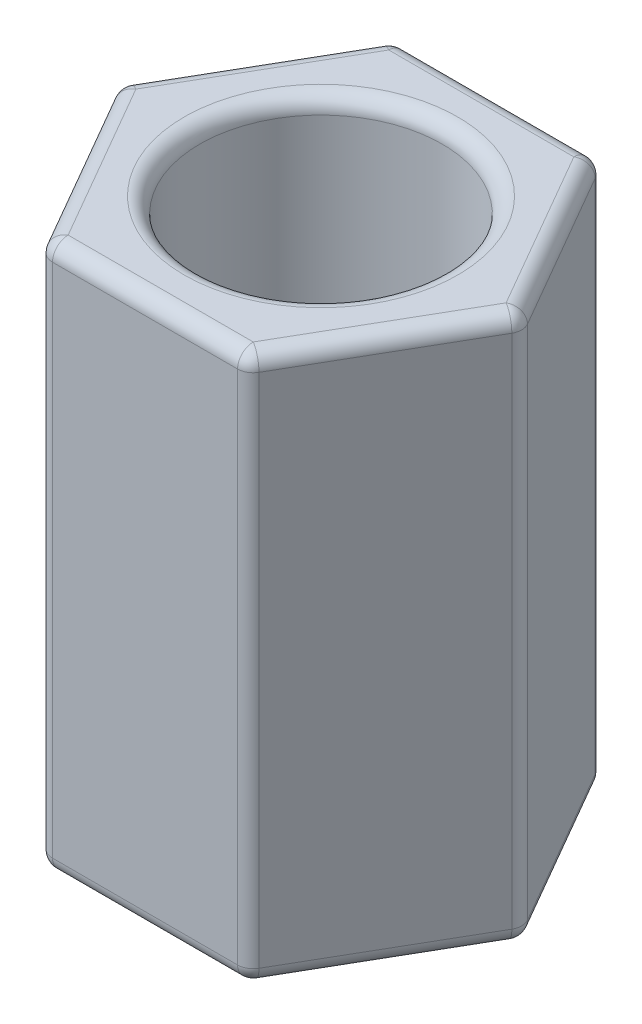
ISO-10303-21;
HEADER;
FILE_DESCRIPTION(('STEP AP214'),'2;1');
FILE_NAME('part.step','',(''),(''),'','','');
FILE_SCHEMA(('AUTOMOTIVE_DESIGN { 1 0 10303 214 1 1 1 1 }'));
ENDSEC;
DATA;
#1=APPLICATION_CONTEXT('core data for automotive mechanical design processes');
#2=APPLICATION_PROTOCOL_DEFINITION('international standard','automotive_design',2000,#1);
#3=PRODUCT_CONTEXT('',#1,'mechanical');
#4=PRODUCT('Part','Part','',(#3));
#5=PRODUCT_RELATED_PRODUCT_CATEGORY('part','',(#4));
#6=PRODUCT_DEFINITION_FORMATION('','',#4);
#7=PRODUCT_DEFINITION_CONTEXT('part definition',#1,'design');
#8=PRODUCT_DEFINITION('design','',#6,#7);
#9=PRODUCT_DEFINITION_SHAPE('','',#8);
#10=(LENGTH_UNIT() NAMED_UNIT(*) SI_UNIT(.MILLI.,.METRE.));
#11=(NAMED_UNIT(*) PLANE_ANGLE_UNIT() SI_UNIT($,.RADIAN.));
#12=(NAMED_UNIT(*) SI_UNIT($,.STERADIAN.) SOLID_ANGLE_UNIT());
#13=UNCERTAINTY_MEASURE_WITH_UNIT(LENGTH_MEASURE(1.E-05),#10,'distance_accuracy_value','');
#14=(GEOMETRIC_REPRESENTATION_CONTEXT(3) GLOBAL_UNCERTAINTY_ASSIGNED_CONTEXT((#13)) GLOBAL_UNIT_ASSIGNED_CONTEXT((#10,
#11,#12)) REPRESENTATION_CONTEXT('',''));
#15=CARTESIAN_POINT('',(0.,0.,0.));
#16=DIRECTION('',(0.,0.,1.));
#17=DIRECTION('',(1.,0.,0.));
#18=AXIS2_PLACEMENT_3D('',#15,#16,#17);
#19=CARTESIAN_POINT('',(0.,7.,-4.5));
#20=DIRECTION('',(0.,0.,1.));
#21=DIRECTION('',(1.,0.,0.));
#22=AXIS2_PLACEMENT_3D('',#19,#20,#21);
#23=PLANE('',#22);
#24=DIRECTION('',(-1.,0.,0.));
#25=VECTOR('',#24,1.);
#26=CARTESIAN_POINT('',(3.89711431702997,6.8,-4.5));
#27=LINE('',#26,#25);
#28=CARTESIAN_POINT('',(1.41450815951458,6.8,-4.5));
#29=VERTEX_POINT('',#28);
#30=CARTESIAN_POINT('',(3.78164426319204,6.8,-4.5));
#31=VERTEX_POINT('',#30);
#32=EDGE_CURVE('E206',#29,#31,#27,.F.);
#33=ORIENTED_EDGE('',*,*,#32,.T.);
#34=DIRECTION('',(0.,-1.,0.));
#35=VECTOR('',#34,1.);
#36=CARTESIAN_POINT('',(3.78164426319204,7.,-4.5));
#37=LINE('',#36,#35);
#38=CARTESIAN_POINT('',(3.78164426319204,0.2,-4.5));
#39=VERTEX_POINT('',#38);
#40=EDGE_CURVE('E176',#31,#39,#37,.T.);
#41=ORIENTED_EDGE('',*,*,#40,.T.);
#42=DIRECTION('',(-1.,0.,0.));
#43=VECTOR('',#42,1.);
#44=CARTESIAN_POINT('',(0.,0.2,-4.5));
#45=LINE('',#44,#43);
#46=CARTESIAN_POINT('',(1.41450815951458,0.2,-4.5));
#47=VERTEX_POINT('',#46);
#48=EDGE_CURVE('E196',#39,#47,#45,.T.);
#49=ORIENTED_EDGE('',*,*,#48,.T.);
#50=DIRECTION('',(0.,-1.,0.));
#51=VECTOR('',#50,1.);
#52=CARTESIAN_POINT('',(1.41450815951458,7.,-4.5));
#53=LINE('',#52,#51);
#54=EDGE_CURVE('E203',#47,#29,#53,.F.);
#55=ORIENTED_EDGE('',*,*,#54,.T.);
#56=EDGE_LOOP('',(#33,#41,#49,#55));
#57=FACE_BOUND('',#56,.T.);
#58=ADVANCED_FACE('F43',(#57),#23,.F.);
#59=CARTESIAN_POINT('',(-0.974278579257493,7.,-0.562499999999997));
#60=DIRECTION('',(0.86602540378444,0.,0.499999999999998));
#61=DIRECTION('',(0.499999999999998,0.,-0.86602540378444));
#62=AXIS2_PLACEMENT_3D('',#59,#60,#61);
#63=PLANE('',#62);
#64=DIRECTION('',(-0.499999999999998,0.,0.86602540378444));
#65=VECTOR('',#64,1.);
#66=CARTESIAN_POINT('',(1.29903810567665,6.8,-4.5));
#67=LINE('',#66,#65);
#68=CARTESIAN_POINT('',(0.0577350269189615,6.8,-2.35));
#69=VERTEX_POINT('',#68);
#70=CARTESIAN_POINT('',(1.24130307875769,6.8,-4.4));
#71=VERTEX_POINT('',#70);
#72=EDGE_CURVE('E248',#69,#71,#67,.F.);
#73=ORIENTED_EDGE('',*,*,#72,.T.);
#74=DIRECTION('',(0.,-1.,0.));
#75=VECTOR('',#74,1.);
#76=CARTESIAN_POINT('',(1.24130307875769,7.,-4.4));
#77=LINE('',#76,#75);
#78=CARTESIAN_POINT('',(1.24130307875769,0.2,-4.4));
#79=VERTEX_POINT('',#78);
#80=EDGE_CURVE('E257',#71,#79,#77,.T.);
#81=ORIENTED_EDGE('',*,*,#80,.T.);
#82=DIRECTION('',(-0.499999999999998,0.,0.86602540378444));
#83=VECTOR('',#82,1.);
#84=CARTESIAN_POINT('',(-0.974278579257493,0.2,-0.562499999999997));
#85=LINE('',#84,#83);
#86=CARTESIAN_POINT('',(0.0577350269189615,0.2,-2.35));
#87=VERTEX_POINT('',#86);
#88=EDGE_CURVE('E254',#79,#87,#85,.T.);
#89=ORIENTED_EDGE('',*,*,#88,.T.);
#90=DIRECTION('',(0.,-1.,0.));
#91=VECTOR('',#90,1.);
#92=CARTESIAN_POINT('',(0.0577350269189616,7.,-2.35));
#93=LINE('',#92,#91);
#94=EDGE_CURVE('E251',#87,#69,#93,.F.);
#95=ORIENTED_EDGE('',*,*,#94,.T.);
#96=EDGE_LOOP('',(#73,#81,#89,#95));
#97=FACE_BOUND('',#96,.T.);
#98=ADVANCED_FACE('F505',(#97),#63,.F.);
#99=CARTESIAN_POINT('',(0.974278579257492,7.,-0.562499999999996));
#100=DIRECTION('',(0.86602540378444,0.,-0.499999999999998));
#101=DIRECTION('',(-0.499999999999998,0.,-0.86602540378444));
#102=AXIS2_PLACEMENT_3D('',#99,#100,#101);
#103=PLANE('',#102);
#104=DIRECTION('',(0.,-1.,0.));
#105=VECTOR('',#104,1.);
#106=CARTESIAN_POINT('',(0.0577350269189615,7.,-2.15));
#107=LINE('',#106,#105);
#108=CARTESIAN_POINT('',(0.0577350269189614,6.8,-2.15));
#109=VERTEX_POINT('',#108);
#110=CARTESIAN_POINT('',(0.0577350269189615,0.2,-2.15));
#111=VERTEX_POINT('',#110);
#112=EDGE_CURVE('E53',#109,#111,#107,.T.);
#113=ORIENTED_EDGE('',*,*,#112,.T.);
#114=DIRECTION('',(0.499999999999998,0.,0.86602540378444));
#115=VECTOR('',#114,1.);
#116=CARTESIAN_POINT('',(0.974278579257492,0.2,-0.562499999999996));
#117=LINE('',#116,#115);
#118=CARTESIAN_POINT('',(1.24130307875769,0.2,-0.1));
#119=VERTEX_POINT('',#118);
#120=EDGE_CURVE('E11',#111,#119,#117,.T.);
#121=ORIENTED_EDGE('',*,*,#120,.T.);
#122=DIRECTION('',(0.,-1.,0.));
#123=VECTOR('',#122,1.);
#124=CARTESIAN_POINT('',(1.24130307875769,7.,-0.1));
#125=LINE('',#124,#123);
#126=CARTESIAN_POINT('',(1.24130307875769,6.8,-0.1));
#127=VERTEX_POINT('',#126);
#128=EDGE_CURVE('E321',#119,#127,#125,.F.);
#129=ORIENTED_EDGE('',*,*,#128,.T.);
#130=DIRECTION('',(0.499999999999998,0.,0.86602540378444));
#131=VECTOR('',#130,1.);
#132=CARTESIAN_POINT('',(0.,6.8,-2.25));
#133=LINE('',#132,#131);
#134=EDGE_CURVE('E318',#127,#109,#133,.F.);
#135=ORIENTED_EDGE('',*,*,#134,.T.);
#136=EDGE_LOOP('',(#113,#121,#129,#135));
#137=FACE_BOUND('',#136,.T.);
#138=ADVANCED_FACE('F472',(#137),#103,.F.);
#139=CARTESIAN_POINT('',(0.,7.,0.));
#140=DIRECTION('',(0.,0.,-1.));
#141=DIRECTION('',(-1.,0.,0.));
#142=AXIS2_PLACEMENT_3D('',#139,#140,#141);
#143=PLANE('',#142);
#144=DIRECTION('',(0.,-1.,0.));
#145=VECTOR('',#144,1.);
#146=CARTESIAN_POINT('',(1.41450815951458,7.,0.));
#147=LINE('',#146,#145);
#148=CARTESIAN_POINT('',(1.41450815951458,6.8,0.));
#149=VERTEX_POINT('',#148);
#150=CARTESIAN_POINT('',(1.41450815951458,0.2,0.));
#151=VERTEX_POINT('',#150);
#152=EDGE_CURVE('E308',#149,#151,#147,.T.);
#153=ORIENTED_EDGE('',*,*,#152,.T.);
#154=DIRECTION('',(1.,0.,0.));
#155=VECTOR('',#154,1.);
#156=CARTESIAN_POINT('',(0.,0.2,0.));
#157=LINE('',#156,#155);
#158=CARTESIAN_POINT('',(3.78164426319204,0.2,0.));
#159=VERTEX_POINT('',#158);
#160=EDGE_CURVE('E314',#151,#159,#157,.T.);
#161=ORIENTED_EDGE('',*,*,#160,.T.);
#162=DIRECTION('',(0.,-1.,0.));
#163=VECTOR('',#162,1.);
#164=CARTESIAN_POINT('',(3.78164426319204,7.,0.));
#165=LINE('',#164,#163);
#166=CARTESIAN_POINT('',(3.78164426319204,6.8,0.));
#167=VERTEX_POINT('',#166);
#168=EDGE_CURVE('E311',#159,#167,#165,.F.);
#169=ORIENTED_EDGE('',*,*,#168,.T.);
#170=DIRECTION('',(1.,0.,0.));
#171=VECTOR('',#170,1.);
#172=CARTESIAN_POINT('',(1.29903810567665,6.8,0.));
#173=LINE('',#172,#171);
#174=EDGE_CURVE('E305',#167,#149,#173,.F.);
#175=ORIENTED_EDGE('',*,*,#174,.T.);
#176=EDGE_LOOP('',(#153,#161,#169,#175));
#177=FACE_BOUND('',#176,.T.);
#178=ADVANCED_FACE('F910',(#177),#143,.F.);
#179=CARTESIAN_POINT('',(2.92283573777248,7.,1.68749999999999));
#180=DIRECTION('',(-0.866025403784439,0.,-0.499999999999999));
#181=DIRECTION('',(-0.499999999999999,0.,0.866025403784439));
#182=AXIS2_PLACEMENT_3D('',#179,#180,#181);
#183=PLANE('',#182);
#184=DIRECTION('',(0.,-1.,0.));
#185=VECTOR('',#184,1.);
#186=CARTESIAN_POINT('',(3.95484934394893,7.,-0.100000000000001));
#187=LINE('',#186,#185);
#188=CARTESIAN_POINT('',(3.95484934394893,6.8,-0.100000000000001));
#189=VERTEX_POINT('',#188);
#190=CARTESIAN_POINT('',(3.95484934394893,0.2,-0.100000000000001));
#191=VERTEX_POINT('',#190);
#192=EDGE_CURVE('E295',#189,#191,#187,.T.);
#193=ORIENTED_EDGE('',*,*,#192,.T.);
#194=DIRECTION('',(0.499999999999999,0.,-0.866025403784439));
#195=VECTOR('',#194,1.);
#196=CARTESIAN_POINT('',(2.92283573777248,0.2,1.68749999999999));
#197=LINE('',#196,#195);
#198=CARTESIAN_POINT('',(5.13841739578766,0.2,-2.15));
#199=VERTEX_POINT('',#198);
#200=EDGE_CURVE('E301',#191,#199,#197,.T.);
#201=ORIENTED_EDGE('',*,*,#200,.T.);
#202=DIRECTION('',(0.,-1.,0.));
#203=VECTOR('',#202,1.);
#204=CARTESIAN_POINT('',(5.13841739578766,7.,-2.15));
#205=LINE('',#204,#203);
#206=CARTESIAN_POINT('',(5.13841739578766,6.8,-2.15));
#207=VERTEX_POINT('',#206);
#208=EDGE_CURVE('E298',#199,#207,#205,.F.);
#209=ORIENTED_EDGE('',*,*,#208,.T.);
#210=DIRECTION('',(0.499999999999999,0.,-0.866025403784439));
#211=VECTOR('',#210,1.);
#212=CARTESIAN_POINT('',(3.89711431702997,6.8,0.));
#213=LINE('',#212,#211);
#214=EDGE_CURVE('E292',#207,#189,#213,.F.);
#215=ORIENTED_EDGE('',*,*,#214,.T.);
#216=EDGE_LOOP('',(#193,#201,#209,#215));
#217=FACE_BOUND('',#216,.T.);
#218=ADVANCED_FACE('F518',(#217),#183,.F.);
#219=CARTESIAN_POINT('',(2.59807621135331,7.,-2.25));
#220=DIRECTION('',(0.,-1.,0.));
#221=DIRECTION('',(0.,0.,-1.));
#222=AXIS2_PLACEMENT_3D('',#219,#220,#221);
#223=CYLINDRICAL_SURFACE('',#222,1.55);
#224=CARTESIAN_POINT('',(2.59807621135331,6.8,-2.25));
#225=DIRECTION('',(0.,1.,0.));
#226=DIRECTION('',(0.,0.,1.));
#227=AXIS2_PLACEMENT_3D('',#224,#225,#226);
#228=CIRCLE('',#227,1.55);
#229=CARTESIAN_POINT('',(2.59807621135331,6.8,-0.700000000000002));
#230=VERTEX_POINT('',#229);
#231=EDGE_CURVE('E288',#230,#230,#228,.T.);
#232=ORIENTED_EDGE('',*,*,#231,.T.);
#233=EDGE_LOOP('',(#232));
#234=FACE_BOUND('',#233,.T.);
#235=CARTESIAN_POINT('',(2.59807621135331,0.2,-2.25));
#236=DIRECTION('',(0.,1.,0.));
#237=DIRECTION('',(0.,0.,1.));
#238=AXIS2_PLACEMENT_3D('',#235,#236,#237);
#239=CIRCLE('',#238,1.55);
#240=CARTESIAN_POINT('',(2.59807621135331,0.2,-0.700000000000002));
#241=VERTEX_POINT('',#240);
#242=EDGE_CURVE('E284',#241,#241,#239,.F.);
#243=ORIENTED_EDGE('',*,*,#242,.T.);
#244=EDGE_LOOP('',(#243));
#245=FACE_BOUND('',#244,.T.);
#246=ADVANCED_FACE('F514',(#234,#245),#223,.F.);
#247=CARTESIAN_POINT('',(4.87139289628747,7.,-2.81249999999999));
#248=DIRECTION('',(-0.866025403784439,0.,0.499999999999999));
#249=DIRECTION('',(0.499999999999999,0.,0.866025403784439));
#250=AXIS2_PLACEMENT_3D('',#247,#248,#249);
#251=PLANE('',#250);
#252=DIRECTION('',(-0.499999999999999,0.,-0.866025403784439));
#253=VECTOR('',#252,1.);
#254=CARTESIAN_POINT('',(4.87139289628747,0.2,-2.81249999999999));
#255=LINE('',#254,#253);
#256=CARTESIAN_POINT('',(5.13841739578766,0.2,-2.35));
#257=VERTEX_POINT('',#256);
#258=CARTESIAN_POINT('',(3.95484934394893,0.2,-4.4));
#259=VERTEX_POINT('',#258);
#260=EDGE_CURVE('E220',#257,#259,#255,.T.);
#261=ORIENTED_EDGE('',*,*,#260,.T.);
#262=DIRECTION('',(0.,-1.,0.));
#263=VECTOR('',#262,1.);
#264=CARTESIAN_POINT('',(3.95484934394893,7.,-4.4));
#265=LINE('',#264,#263);
#266=CARTESIAN_POINT('',(3.95484934394893,6.8,-4.4));
#267=VERTEX_POINT('',#266);
#268=EDGE_CURVE('E178',#259,#267,#265,.F.);
#269=ORIENTED_EDGE('',*,*,#268,.T.);
#270=DIRECTION('',(-0.499999999999999,0.,-0.866025403784439));
#271=VECTOR('',#270,1.);
#272=CARTESIAN_POINT('',(5.19615242270662,6.8,-2.25));
#273=LINE('',#272,#271);
#274=CARTESIAN_POINT('',(5.13841739578766,6.8,-2.35));
#275=VERTEX_POINT('',#274);
#276=EDGE_CURVE('E209',#267,#275,#273,.F.);
#277=ORIENTED_EDGE('',*,*,#276,.T.);
#278=DIRECTION('',(0.,-1.,0.));
#279=VECTOR('',#278,1.);
#280=CARTESIAN_POINT('',(5.13841739578766,7.,-2.35));
#281=LINE('',#280,#279);
#282=EDGE_CURVE('E213',#275,#257,#281,.T.);
#283=ORIENTED_EDGE('',*,*,#282,.T.);
#284=EDGE_LOOP('',(#261,#269,#277,#283));
#285=FACE_BOUND('',#284,.T.);
#286=ADVANCED_FACE('F517',(#285),#251,.F.);
#287=CARTESIAN_POINT('',(0.,7.,0.));
#288=DIRECTION('',(0.,1.,0.));
#289=DIRECTION('',(0.,0.,1.));
#290=AXIS2_PLACEMENT_3D('',#287,#288,#289);
#291=PLANE('',#290);
#292=CARTESIAN_POINT('',(2.59807621135331,7.,-2.25));
#293=DIRECTION('',(0.,1.,0.));
#294=DIRECTION('',(0.,0.,1.));
#295=AXIS2_PLACEMENT_3D('',#292,#293,#294);
#296=CIRCLE('',#295,1.75);
#297=CARTESIAN_POINT('',(2.59807621135331,7.,-0.500000000000002));
#298=VERTEX_POINT('',#297);
#299=EDGE_CURVE('E244',#298,#298,#296,.F.);
#300=ORIENTED_EDGE('',*,*,#299,.T.);
#301=EDGE_LOOP('',(#300));
#302=FACE_BOUND('',#301,.T.);
#303=DIRECTION('',(-1.,0.,0.));
#304=VECTOR('',#303,1.);
#305=CARTESIAN_POINT('',(1.29903810567665,7.,-4.3));
#306=LINE('',#305,#304);
#307=CARTESIAN_POINT('',(3.78164426319204,7.,-4.3));
#308=VERTEX_POINT('',#307);
#309=CARTESIAN_POINT('',(1.41450815951458,7.,-4.3));
#310=VERTEX_POINT('',#309);
#311=EDGE_CURVE('E237',#308,#310,#306,.T.);
#312=ORIENTED_EDGE('',*,*,#311,.T.);
#313=DIRECTION('',(-0.499999999999998,0.,0.86602540378444));
#314=VECTOR('',#313,1.);
#315=CARTESIAN_POINT('',(0.173205080756887,7.,-2.15));
#316=LINE('',#315,#314);
#317=CARTESIAN_POINT('',(0.230940107675849,7.,-2.25));
#318=VERTEX_POINT('',#317);
#319=EDGE_CURVE('E241',#310,#318,#316,.T.);
#320=ORIENTED_EDGE('',*,*,#319,.T.);
#321=DIRECTION('',(0.499999999999998,0.,0.86602540378444));
#322=VECTOR('',#321,1.);
#323=CARTESIAN_POINT('',(1.47224318643354,7.,-0.0999999999999995));
#324=LINE('',#323,#322);
#325=CARTESIAN_POINT('',(1.41450815951458,7.,-0.2));
#326=VERTEX_POINT('',#325);
#327=EDGE_CURVE('E234',#318,#326,#324,.T.);
#328=ORIENTED_EDGE('',*,*,#327,.T.);
#329=DIRECTION('',(1.,0.,0.));
#330=VECTOR('',#329,1.);
#331=CARTESIAN_POINT('',(3.89711431702997,7.,-0.2));
#332=LINE('',#331,#330);
#333=CARTESIAN_POINT('',(3.78164426319204,7.,-0.2));
#334=VERTEX_POINT('',#333);
#335=EDGE_CURVE('E225',#326,#334,#332,.T.);
#336=ORIENTED_EDGE('',*,*,#335,.T.);
#337=DIRECTION('',(0.499999999999999,0.,-0.866025403784439));
#338=VECTOR('',#337,1.);
#339=CARTESIAN_POINT('',(5.02294734194973,7.,-2.35));
#340=LINE('',#339,#338);
#341=CARTESIAN_POINT('',(4.96521231503077,7.,-2.25));
#342=VERTEX_POINT('',#341);
#343=EDGE_CURVE('E228',#334,#342,#340,.T.);
#344=ORIENTED_EDGE('',*,*,#343,.T.);
#345=DIRECTION('',(-0.499999999999999,0.,-0.866025403784439));
#346=VECTOR('',#345,1.);
#347=CARTESIAN_POINT('',(3.72390923627308,7.,-4.4));
#348=LINE('',#347,#346);
#349=EDGE_CURVE('E231',#342,#308,#348,.T.);
#350=ORIENTED_EDGE('',*,*,#349,.T.);
#351=EDGE_LOOP('',(#312,#320,#328,#336,#344,#350));
#352=FACE_BOUND('',#351,.T.);
#353=ADVANCED_FACE('F464',(#302,#352),#291,.T.);
#354=CARTESIAN_POINT('',(0.,0.,0.));
#355=DIRECTION('',(0.,1.,0.));
#356=DIRECTION('',(0.,0.,1.));
#357=AXIS2_PLACEMENT_3D('',#354,#355,#356);
#358=PLANE('',#357);
#359=CARTESIAN_POINT('',(2.59807621135331,0.,-2.25));
#360=DIRECTION('',(0.,1.,0.));
#361=DIRECTION('',(0.,0.,1.));
#362=AXIS2_PLACEMENT_3D('',#359,#360,#361);
#363=CIRCLE('',#362,1.75);
#364=CARTESIAN_POINT('',(2.59807621135331,0.,-0.500000000000002));
#365=VERTEX_POINT('',#364);
#366=EDGE_CURVE('E280',#365,#365,#363,.T.);
#367=ORIENTED_EDGE('',*,*,#366,.T.);
#368=EDGE_LOOP('',(#367));
#369=FACE_BOUND('',#368,.T.);
#370=DIRECTION('',(-0.499999999999998,0.,0.86602540378444));
#371=VECTOR('',#370,1.);
#372=CARTESIAN_POINT('',(-0.801073498500604,0.,-0.462499999999997));
#373=LINE('',#372,#371);
#374=CARTESIAN_POINT('',(0.23094010767585,0.,-2.25));
#375=VERTEX_POINT('',#374);
#376=CARTESIAN_POINT('',(1.41450815951458,0.,-4.3));
#377=VERTEX_POINT('',#376);
#378=EDGE_CURVE('E261',#375,#377,#373,.F.);
#379=ORIENTED_EDGE('',*,*,#378,.T.);
#380=DIRECTION('',(-1.,0.,0.));
#381=VECTOR('',#380,1.);
#382=CARTESIAN_POINT('',(0.,0.,-4.3));
#383=LINE('',#382,#381);
#384=CARTESIAN_POINT('',(3.78164426319204,0.,-4.3));
#385=VERTEX_POINT('',#384);
#386=EDGE_CURVE('E276',#377,#385,#383,.F.);
#387=ORIENTED_EDGE('',*,*,#386,.T.);
#388=DIRECTION('',(-0.499999999999999,0.,-0.866025403784439));
#389=VECTOR('',#388,1.);
#390=CARTESIAN_POINT('',(4.69818781553058,0.,-2.71249999999999));
#391=LINE('',#390,#389);
#392=CARTESIAN_POINT('',(4.96521231503077,0.,-2.25));
#393=VERTEX_POINT('',#392);
#394=EDGE_CURVE('E273',#385,#393,#391,.F.);
#395=ORIENTED_EDGE('',*,*,#394,.T.);
#396=DIRECTION('',(0.499999999999999,0.,-0.866025403784439));
#397=VECTOR('',#396,1.);
#398=CARTESIAN_POINT('',(2.74963065701559,0.,1.58749999999999));
#399=LINE('',#398,#397);
#400=CARTESIAN_POINT('',(3.78164426319204,0.,-0.2));
#401=VERTEX_POINT('',#400);
#402=EDGE_CURVE('E270',#393,#401,#399,.F.);
#403=ORIENTED_EDGE('',*,*,#402,.T.);
#404=DIRECTION('',(1.,0.,0.));
#405=VECTOR('',#404,1.);
#406=CARTESIAN_POINT('',(0.,0.,-0.2));
#407=LINE('',#406,#405);
#408=CARTESIAN_POINT('',(1.41450815951458,0.,-0.2));
#409=VERTEX_POINT('',#408);
#410=EDGE_CURVE('E267',#401,#409,#407,.F.);
#411=ORIENTED_EDGE('',*,*,#410,.T.);
#412=DIRECTION('',(0.499999999999998,0.,0.86602540378444));
#413=VECTOR('',#412,1.);
#414=CARTESIAN_POINT('',(1.14748366001438,0.,-0.662499999999996));
#415=LINE('',#414,#413);
#416=EDGE_CURVE('E264',#409,#375,#415,.F.);
#417=ORIENTED_EDGE('',*,*,#416,.T.);
#418=EDGE_LOOP('',(#379,#387,#395,#403,#411,#417));
#419=FACE_BOUND('',#418,.T.);
#420=ADVANCED_FACE('F486',(#369,#419),#358,.F.);
#421=CARTESIAN_POINT('',(1.41450815951458,7.,-0.2));
#422=DIRECTION('',(0.,-1.,0.));
#423=DIRECTION('',(0.,0.,-1.));
#424=AXIS2_PLACEMENT_3D('',#421,#422,#423);
#425=CYLINDRICAL_SURFACE('',#424,0.2);
#426=CARTESIAN_POINT('',(1.41450815951458,6.8,-0.2));
#427=DIRECTION('',(0.,1.,0.));
#428=DIRECTION('',(0.,0.,1.));
#429=AXIS2_PLACEMENT_3D('',#426,#427,#428);
#430=CIRCLE('',#429,0.2);
#431=EDGE_CURVE('E47',#127,#149,#430,.T.);
#432=ORIENTED_EDGE('',*,*,#431,.F.);
#433=ORIENTED_EDGE('',*,*,#128,.F.);
#434=CARTESIAN_POINT('',(1.41450815951458,0.2,-0.2));
#435=DIRECTION('',(0.,-1.,0.));
#436=DIRECTION('',(0.,0.,-1.));
#437=AXIS2_PLACEMENT_3D('',#434,#435,#436);
#438=CIRCLE('',#437,0.2);
#439=EDGE_CURVE('E440',#151,#119,#438,.T.);
#440=ORIENTED_EDGE('',*,*,#439,.F.);
#441=ORIENTED_EDGE('',*,*,#152,.F.);
#442=EDGE_LOOP('',(#432,#433,#440,#441));
#443=FACE_BOUND('',#442,.T.);
#444=ADVANCED_FACE('F502',(#443),#425,.T.);
#445=CARTESIAN_POINT('',(1.41450815951458,6.8,-0.2));
#446=DIRECTION('',(0.,1.,0.));
#447=DIRECTION('',(0.,0.,1.));
#448=AXIS2_PLACEMENT_3D('',#445,#446,#447);
#449=SPHERICAL_SURFACE('',#448,0.2);
#450=CARTESIAN_POINT('',(1.41450815951458,6.8,-0.2));
#451=DIRECTION('',(0.499999999999998,0.,0.86602540378444));
#452=DIRECTION('',(0.86602540378444,0.,-0.499999999999998));
#453=AXIS2_PLACEMENT_3D('',#450,#451,#452);
#454=CIRCLE('',#453,0.2);
#455=EDGE_CURVE('E433',#127,#326,#454,.F.);
#456=ORIENTED_EDGE('',*,*,#455,.F.);
#457=ORIENTED_EDGE('',*,*,#431,.T.);
#458=CARTESIAN_POINT('',(1.41450815951458,6.8,-0.2));
#459=DIRECTION('',(-1.,0.,0.));
#460=DIRECTION('',(0.,0.,1.));
#461=AXIS2_PLACEMENT_3D('',#458,#459,#460);
#462=CIRCLE('',#461,0.2);
#463=EDGE_CURVE('E437',#326,#149,#462,.F.);
#464=ORIENTED_EDGE('',*,*,#463,.F.);
#465=EDGE_LOOP('',(#456,#457,#464));
#466=FACE_BOUND('',#465,.T.);
#467=ADVANCED_FACE('F452',(#466),#449,.T.);
#468=CARTESIAN_POINT('',(1.41450815951458,0.2,-0.2));
#469=DIRECTION('',(0.,-1.,0.));
#470=DIRECTION('',(0.,0.,-1.));
#471=AXIS2_PLACEMENT_3D('',#468,#469,#470);
#472=SPHERICAL_SURFACE('',#471,0.2);
#473=CARTESIAN_POINT('',(1.41450815951458,0.2,-0.2));
#474=DIRECTION('',(-1.,0.,0.));
#475=DIRECTION('',(0.,0.,1.));
#476=AXIS2_PLACEMENT_3D('',#473,#474,#475);
#477=CIRCLE('',#476,0.2);
#478=EDGE_CURVE('E427',#151,#409,#477,.F.);
#479=ORIENTED_EDGE('',*,*,#478,.F.);
#480=ORIENTED_EDGE('',*,*,#439,.T.);
#481=CARTESIAN_POINT('',(1.41450815951458,0.2,-0.2));
#482=DIRECTION('',(0.499999999999998,0.,0.86602540378444));
#483=DIRECTION('',(0.86602540378444,0.,-0.499999999999998));
#484=AXIS2_PLACEMENT_3D('',#481,#482,#483);
#485=CIRCLE('',#484,0.2);
#486=EDGE_CURVE('E66',#409,#119,#485,.F.);
#487=ORIENTED_EDGE('',*,*,#486,.F.);
#488=EDGE_LOOP('',(#479,#480,#487));
#489=FACE_BOUND('',#488,.T.);
#490=ADVANCED_FACE('F494',(#489),#472,.T.);
#491=CARTESIAN_POINT('',(0.,6.8,-0.2));
#492=DIRECTION('',(-1.,0.,0.));
#493=DIRECTION('',(0.,0.,1.));
#494=AXIS2_PLACEMENT_3D('',#491,#492,#493);
#495=CYLINDRICAL_SURFACE('',#494,0.2);
#496=ORIENTED_EDGE('',*,*,#463,.T.);
#497=ORIENTED_EDGE('',*,*,#174,.F.);
#498=CARTESIAN_POINT('',(3.78164426319204,6.8,-0.2));
#499=DIRECTION('',(1.,0.,0.));
#500=DIRECTION('',(0.,0.,-1.));
#501=AXIS2_PLACEMENT_3D('',#498,#499,#500);
#502=CIRCLE('',#501,0.2);
#503=EDGE_CURVE('E419',#334,#167,#502,.T.);
#504=ORIENTED_EDGE('',*,*,#503,.F.);
#505=ORIENTED_EDGE('',*,*,#335,.F.);
#506=EDGE_LOOP('',(#496,#497,#504,#505));
#507=FACE_BOUND('',#506,.T.);
#508=ADVANCED_FACE('F459',(#507),#495,.T.);
#509=CARTESIAN_POINT('',(1.14748366001438,6.8,-0.662499999999996));
#510=DIRECTION('',(-0.499999999999998,0.,-0.86602540378444));
#511=DIRECTION('',(-0.86602540378444,0.,0.499999999999998));
#512=AXIS2_PLACEMENT_3D('',#509,#510,#511);
#513=CYLINDRICAL_SURFACE('',#512,0.2);
#514=ORIENTED_EDGE('',*,*,#455,.T.);
#515=ORIENTED_EDGE('',*,*,#327,.F.);
#516=CARTESIAN_POINT('',(0.230940107675849,6.8,-2.25));
#517=DIRECTION('',(-0.499999999999999,0.,-0.866025403784439));
#518=DIRECTION('',(-0.866025403784439,0.,0.499999999999999));
#519=AXIS2_PLACEMENT_3D('',#516,#517,#518);
#520=CIRCLE('',#519,0.2);
#521=EDGE_CURVE('E415',#109,#318,#520,.T.);
#522=ORIENTED_EDGE('',*,*,#521,.F.);
#523=ORIENTED_EDGE('',*,*,#134,.F.);
#524=EDGE_LOOP('',(#514,#515,#522,#523));
#525=FACE_BOUND('',#524,.T.);
#526=ADVANCED_FACE('F471',(#525),#513,.T.);
#527=CARTESIAN_POINT('',(0.230940107675849,7.,-2.25));
#528=DIRECTION('',(0.,-1.,0.));
#529=DIRECTION('',(0.,0.,-1.));
#530=AXIS2_PLACEMENT_3D('',#527,#528,#529);
#531=CYLINDRICAL_SURFACE('',#530,0.2);
#532=CARTESIAN_POINT('',(0.230940107675849,0.2,-2.25));
#533=DIRECTION('',(0.,-1.,0.));
#534=DIRECTION('',(0.,0.,-1.));
#535=AXIS2_PLACEMENT_3D('',#532,#533,#534);
#536=CIRCLE('',#535,0.2);
#537=EDGE_CURVE('E407',#111,#87,#536,.T.);
#538=ORIENTED_EDGE('',*,*,#537,.F.);
#539=ORIENTED_EDGE('',*,*,#112,.F.);
#540=CARTESIAN_POINT('',(0.230940107675849,6.8,-2.25));
#541=DIRECTION('',(0.,1.,0.));
#542=DIRECTION('',(0.,0.,1.));
#543=AXIS2_PLACEMENT_3D('',#540,#541,#542);
#544=CIRCLE('',#543,0.2);
#545=EDGE_CURVE('E411',#69,#109,#544,.T.);
#546=ORIENTED_EDGE('',*,*,#545,.F.);
#547=ORIENTED_EDGE('',*,*,#94,.F.);
#548=EDGE_LOOP('',(#538,#539,#546,#547));
#549=FACE_BOUND('',#548,.T.);
#550=ADVANCED_FACE('F476',(#549),#531,.T.);
#551=CARTESIAN_POINT('',(1.14748366001438,0.2,-0.662499999999996));
#552=DIRECTION('',(0.499999999999998,0.,0.86602540378444));
#553=DIRECTION('',(0.86602540378444,0.,-0.499999999999998));
#554=AXIS2_PLACEMENT_3D('',#551,#552,#553);
#555=CYLINDRICAL_SURFACE('',#554,0.2);
#556=ORIENTED_EDGE('',*,*,#486,.T.);
#557=ORIENTED_EDGE('',*,*,#120,.F.);
#558=CARTESIAN_POINT('',(0.23094010767585,0.2,-2.25));
#559=DIRECTION('',(-0.499999999999995,0.,-0.866025403784441));
#560=DIRECTION('',(-0.866025403784442,0.,0.499999999999995));
#561=AXIS2_PLACEMENT_3D('',#558,#559,#560);
#562=CIRCLE('',#561,0.2);
#563=EDGE_CURVE('E403',#375,#111,#562,.T.);
#564=ORIENTED_EDGE('',*,*,#563,.F.);
#565=ORIENTED_EDGE('',*,*,#416,.F.);
#566=EDGE_LOOP('',(#556,#557,#564,#565));
#567=FACE_BOUND('',#566,.T.);
#568=ADVANCED_FACE('F484',(#567),#555,.T.);
#569=CARTESIAN_POINT('',(0.,0.2,-0.2));
#570=DIRECTION('',(1.,0.,0.));
#571=DIRECTION('',(0.,0.,-1.));
#572=AXIS2_PLACEMENT_3D('',#569,#570,#571);
#573=CYLINDRICAL_SURFACE('',#572,0.2);
#574=ORIENTED_EDGE('',*,*,#478,.T.);
#575=ORIENTED_EDGE('',*,*,#410,.F.);
#576=CARTESIAN_POINT('',(3.78164426319204,0.2,-0.2));
#577=DIRECTION('',(1.,0.,0.));
#578=DIRECTION('',(0.,1.,0.));
#579=AXIS2_PLACEMENT_3D('',#576,#577,#578);
#580=CIRCLE('',#579,0.2);
#581=EDGE_CURVE('E399',#159,#401,#580,.T.);
#582=ORIENTED_EDGE('',*,*,#581,.F.);
#583=ORIENTED_EDGE('',*,*,#160,.F.);
#584=EDGE_LOOP('',(#574,#575,#582,#583));
#585=FACE_BOUND('',#584,.T.);
#586=ADVANCED_FACE('F493',(#585),#573,.T.);
#587=CARTESIAN_POINT('',(3.78164426319204,7.,-0.2));
#588=DIRECTION('',(0.,-1.,0.));
#589=DIRECTION('',(0.,0.,-1.));
#590=AXIS2_PLACEMENT_3D('',#587,#588,#589);
#591=CYLINDRICAL_SURFACE('',#590,0.2);
#592=CARTESIAN_POINT('',(3.78164426319204,6.8,-0.2));
#593=DIRECTION('',(0.,1.,0.));
#594=DIRECTION('',(0.,0.,1.));
#595=AXIS2_PLACEMENT_3D('',#592,#593,#594);
#596=CIRCLE('',#595,0.2);
#597=EDGE_CURVE('E423',#167,#189,#596,.T.);
#598=ORIENTED_EDGE('',*,*,#597,.F.);
#599=ORIENTED_EDGE('',*,*,#168,.F.);
#600=CARTESIAN_POINT('',(3.78164426319204,0.2,-0.2));
#601=DIRECTION('',(0.,-1.,0.));
#602=DIRECTION('',(0.,0.,-1.));
#603=AXIS2_PLACEMENT_3D('',#600,#601,#602);
#604=CIRCLE('',#603,0.2);
#605=EDGE_CURVE('E396',#191,#159,#604,.T.);
#606=ORIENTED_EDGE('',*,*,#605,.F.);
#607=ORIENTED_EDGE('',*,*,#192,.F.);
#608=EDGE_LOOP('',(#598,#599,#606,#607));
#609=FACE_BOUND('',#608,.T.);
#610=ADVANCED_FACE('F596',(#609),#591,.T.);
#611=CARTESIAN_POINT('',(3.78164426319204,6.8,-0.2));
#612=DIRECTION('',(0.,1.,0.));
#613=DIRECTION('',(0.,0.,1.));
#614=AXIS2_PLACEMENT_3D('',#611,#612,#613);
#615=SPHERICAL_SURFACE('',#614,0.2);
#616=ORIENTED_EDGE('',*,*,#503,.T.);
#617=ORIENTED_EDGE('',*,*,#597,.T.);
#618=CARTESIAN_POINT('',(3.78164426319204,6.8,-0.2));
#619=DIRECTION('',(-0.499999999999999,0.,0.866025403784439));
#620=DIRECTION('',(0.866025403784439,0.,0.499999999999999));
#621=AXIS2_PLACEMENT_3D('',#618,#619,#620);
#622=CIRCLE('',#621,0.2);
#623=EDGE_CURVE('E392',#334,#189,#622,.F.);
#624=ORIENTED_EDGE('',*,*,#623,.F.);
#625=EDGE_LOOP('',(#616,#617,#624));
#626=FACE_BOUND('',#625,.T.);
#627=ADVANCED_FACE('F592',(#626),#615,.T.);
#628=CARTESIAN_POINT('',(0.230940107675849,6.8,-2.25));
#629=DIRECTION('',(0.,1.,0.));
#630=DIRECTION('',(0.,0.,1.));
#631=AXIS2_PLACEMENT_3D('',#628,#629,#630);
#632=SPHERICAL_SURFACE('',#631,0.2);
#633=ORIENTED_EDGE('',*,*,#545,.T.);
#634=ORIENTED_EDGE('',*,*,#521,.T.);
#635=CARTESIAN_POINT('',(0.230940107675849,6.8,-2.25));
#636=DIRECTION('',(-0.499999999999999,0.,0.866025403784439));
#637=DIRECTION('',(0.866025403784439,0.,0.5));
#638=AXIS2_PLACEMENT_3D('',#635,#636,#637);
#639=CIRCLE('',#638,0.2);
#640=EDGE_CURVE('E388',#69,#318,#639,.F.);
#641=ORIENTED_EDGE('',*,*,#640,.F.);
#642=EDGE_LOOP('',(#633,#634,#641));
#643=FACE_BOUND('',#642,.T.);
#644=ADVANCED_FACE('F589',(#643),#632,.T.);
#645=CARTESIAN_POINT('',(0.230940107675849,0.2,-2.25));
#646=DIRECTION('',(0.,-1.,0.));
#647=DIRECTION('',(0.,0.,-1.));
#648=AXIS2_PLACEMENT_3D('',#645,#646,#647);
#649=SPHERICAL_SURFACE('',#648,0.2);
#650=ORIENTED_EDGE('',*,*,#563,.T.);
#651=ORIENTED_EDGE('',*,*,#537,.T.);
#652=CARTESIAN_POINT('',(0.230940107675849,0.2,-2.25));
#653=DIRECTION('',(-0.499999999999999,0.,0.866025403784439));
#654=DIRECTION('',(0.866025403784439,0.,0.499999999999999));
#655=AXIS2_PLACEMENT_3D('',#652,#653,#654);
#656=CIRCLE('',#655,0.2);
#657=EDGE_CURVE('E384',#375,#87,#656,.F.);
#658=ORIENTED_EDGE('',*,*,#657,.F.);
#659=EDGE_LOOP('',(#650,#651,#658));
#660=FACE_BOUND('',#659,.T.);
#661=ADVANCED_FACE('F482',(#660),#649,.T.);
#662=CARTESIAN_POINT('',(3.78164426319204,0.2,-0.2));
#663=DIRECTION('',(0.,-1.,0.));
#664=DIRECTION('',(0.,0.,-1.));
#665=AXIS2_PLACEMENT_3D('',#662,#663,#664);
#666=SPHERICAL_SURFACE('',#665,0.2);
#667=ORIENTED_EDGE('',*,*,#605,.T.);
#668=ORIENTED_EDGE('',*,*,#581,.T.);
#669=CARTESIAN_POINT('',(3.78164426319204,0.2,-0.2));
#670=DIRECTION('',(-0.499999999999997,0.,0.86602540378444));
#671=DIRECTION('',(0.86602540378444,0.,0.499999999999997));
#672=AXIS2_PLACEMENT_3D('',#669,#670,#671);
#673=CIRCLE('',#672,0.2);
#674=EDGE_CURVE('E380',#191,#401,#673,.F.);
#675=ORIENTED_EDGE('',*,*,#674,.F.);
#676=EDGE_LOOP('',(#667,#668,#675));
#677=FACE_BOUND('',#676,.T.);
#678=ADVANCED_FACE('F582',(#677),#666,.T.);
#679=CARTESIAN_POINT('',(2.74963065701559,6.8,1.58749999999999));
#680=DIRECTION('',(-0.499999999999999,0.,0.866025403784439));
#681=DIRECTION('',(0.866025403784439,0.,0.499999999999999));
#682=AXIS2_PLACEMENT_3D('',#679,#680,#681);
#683=CYLINDRICAL_SURFACE('',#682,0.2);
#684=ORIENTED_EDGE('',*,*,#623,.T.);
#685=ORIENTED_EDGE('',*,*,#214,.F.);
#686=CARTESIAN_POINT('',(4.96521231503077,6.8,-2.25));
#687=DIRECTION('',(0.499999999999998,0.,-0.86602540378444));
#688=DIRECTION('',(-0.86602540378444,0.,-0.499999999999998));
#689=AXIS2_PLACEMENT_3D('',#686,#687,#688);
#690=CIRCLE('',#689,0.2);
#691=EDGE_CURVE('E372',#342,#207,#690,.T.);
#692=ORIENTED_EDGE('',*,*,#691,.F.);
#693=ORIENTED_EDGE('',*,*,#343,.F.);
#694=EDGE_LOOP('',(#684,#685,#692,#693));
#695=FACE_BOUND('',#694,.T.);
#696=ADVANCED_FACE('F578',(#695),#683,.T.);
#697=CARTESIAN_POINT('',(-0.801073498500605,6.8,-0.462499999999997));
#698=DIRECTION('',(0.499999999999998,0.,-0.86602540378444));
#699=DIRECTION('',(-0.86602540378444,0.,-0.499999999999998));
#700=AXIS2_PLACEMENT_3D('',#697,#698,#699);
#701=CYLINDRICAL_SURFACE('',#700,0.2);
#702=ORIENTED_EDGE('',*,*,#640,.T.);
#703=ORIENTED_EDGE('',*,*,#319,.F.);
#704=CARTESIAN_POINT('',(1.41450815951458,6.8,-4.3));
#705=DIRECTION('',(0.499999999999997,0.,-0.86602540378444));
#706=DIRECTION('',(-0.86602540378444,0.,-0.499999999999997));
#707=AXIS2_PLACEMENT_3D('',#704,#705,#706);
#708=CIRCLE('',#707,0.2);
#709=EDGE_CURVE('E368',#71,#310,#708,.T.);
#710=ORIENTED_EDGE('',*,*,#709,.F.);
#711=ORIENTED_EDGE('',*,*,#72,.F.);
#712=EDGE_LOOP('',(#702,#703,#710,#711));
#713=FACE_BOUND('',#712,.T.);
#714=ADVANCED_FACE('F574',(#713),#701,.T.);
#715=CARTESIAN_POINT('',(1.41450815951458,7.,-4.3));
#716=DIRECTION('',(0.,-1.,0.));
#717=DIRECTION('',(0.,0.,-1.));
#718=AXIS2_PLACEMENT_3D('',#715,#716,#717);
#719=CYLINDRICAL_SURFACE('',#718,0.2);
#720=CARTESIAN_POINT('',(1.41450815951458,0.2,-4.3));
#721=DIRECTION('',(0.,-1.,0.));
#722=DIRECTION('',(0.,0.,-1.));
#723=AXIS2_PLACEMENT_3D('',#720,#721,#722);
#724=CIRCLE('',#723,0.2);
#725=EDGE_CURVE('E360',#79,#47,#724,.T.);
#726=ORIENTED_EDGE('',*,*,#725,.F.);
#727=ORIENTED_EDGE('',*,*,#80,.F.);
#728=CARTESIAN_POINT('',(1.41450815951458,6.8,-4.3));
#729=DIRECTION('',(0.,1.,0.));
#730=DIRECTION('',(0.,0.,1.));
#731=AXIS2_PLACEMENT_3D('',#728,#729,#730);
#732=CIRCLE('',#731,0.2);
#733=EDGE_CURVE('E364',#29,#71,#732,.T.);
#734=ORIENTED_EDGE('',*,*,#733,.F.);
#735=ORIENTED_EDGE('',*,*,#54,.F.);
#736=EDGE_LOOP('',(#726,#727,#734,#735));
#737=FACE_BOUND('',#736,.T.);
#738=ADVANCED_FACE('F570',(#737),#719,.T.);
#739=CARTESIAN_POINT('',(-0.801073498500604,0.2,-0.462499999999997));
#740=DIRECTION('',(-0.499999999999998,0.,0.86602540378444));
#741=DIRECTION('',(0.86602540378444,0.,0.499999999999998));
#742=AXIS2_PLACEMENT_3D('',#739,#740,#741);
#743=CYLINDRICAL_SURFACE('',#742,0.2);
#744=ORIENTED_EDGE('',*,*,#657,.T.);
#745=ORIENTED_EDGE('',*,*,#88,.F.);
#746=CARTESIAN_POINT('',(1.41450815951458,0.2,-4.3));
#747=DIRECTION('',(0.499999999999996,0.,-0.866025403784441));
#748=DIRECTION('',(-0.866025403784441,0.,-0.499999999999996));
#749=AXIS2_PLACEMENT_3D('',#746,#747,#748);
#750=CIRCLE('',#749,0.2);
#751=EDGE_CURVE('E357',#377,#79,#750,.T.);
#752=ORIENTED_EDGE('',*,*,#751,.F.);
#753=ORIENTED_EDGE('',*,*,#378,.F.);
#754=EDGE_LOOP('',(#744,#745,#752,#753));
#755=FACE_BOUND('',#754,.T.);
#756=ADVANCED_FACE('F566',(#755),#743,.T.);
#757=CARTESIAN_POINT('',(2.74963065701559,0.2,1.58749999999999));
#758=DIRECTION('',(0.499999999999999,0.,-0.866025403784439));
#759=DIRECTION('',(-0.866025403784439,0.,-0.499999999999999));
#760=AXIS2_PLACEMENT_3D('',#757,#758,#759);
#761=CYLINDRICAL_SURFACE('',#760,0.2);
#762=ORIENTED_EDGE('',*,*,#674,.T.);
#763=ORIENTED_EDGE('',*,*,#402,.F.);
#764=CARTESIAN_POINT('',(4.96521231503077,0.2,-2.25));
#765=DIRECTION('',(0.499999999999998,0.,-0.86602540378444));
#766=DIRECTION('',(-0.86602540378444,0.,-0.499999999999998));
#767=AXIS2_PLACEMENT_3D('',#764,#765,#766);
#768=CIRCLE('',#767,0.2);
#769=EDGE_CURVE('E353',#199,#393,#768,.T.);
#770=ORIENTED_EDGE('',*,*,#769,.F.);
#771=ORIENTED_EDGE('',*,*,#200,.F.);
#772=EDGE_LOOP('',(#762,#763,#770,#771));
#773=FACE_BOUND('',#772,.T.);
#774=ADVANCED_FACE('F562',(#773),#761,.T.);
#775=CARTESIAN_POINT('',(4.96521231503077,7.,-2.25));
#776=DIRECTION('',(0.,-1.,0.));
#777=DIRECTION('',(0.,0.,-1.));
#778=AXIS2_PLACEMENT_3D('',#775,#776,#777);
#779=CYLINDRICAL_SURFACE('',#778,0.2);
#780=CARTESIAN_POINT('',(4.96521231503077,6.8,-2.25));
#781=DIRECTION('',(0.,1.,0.));
#782=DIRECTION('',(0.,0.,1.));
#783=AXIS2_PLACEMENT_3D('',#780,#781,#782);
#784=CIRCLE('',#783,0.2);
#785=EDGE_CURVE('E376',#207,#275,#784,.T.);
#786=ORIENTED_EDGE('',*,*,#785,.F.);
#787=ORIENTED_EDGE('',*,*,#208,.F.);
#788=CARTESIAN_POINT('',(4.96521231503077,0.2,-2.25));
#789=DIRECTION('',(0.,-1.,0.));
#790=DIRECTION('',(0.,0.,-1.));
#791=AXIS2_PLACEMENT_3D('',#788,#789,#790);
#792=CIRCLE('',#791,0.2);
#793=EDGE_CURVE('E350',#257,#199,#792,.T.);
#794=ORIENTED_EDGE('',*,*,#793,.F.);
#795=ORIENTED_EDGE('',*,*,#282,.F.);
#796=EDGE_LOOP('',(#786,#787,#794,#795));
#797=FACE_BOUND('',#796,.T.);
#798=ADVANCED_FACE('F558',(#797),#779,.T.);
#799=CARTESIAN_POINT('',(4.96521231503077,6.8,-2.25));
#800=DIRECTION('',(0.,1.,0.));
#801=DIRECTION('',(0.,0.,1.));
#802=AXIS2_PLACEMENT_3D('',#799,#800,#801);
#803=SPHERICAL_SURFACE('',#802,0.2);
#804=ORIENTED_EDGE('',*,*,#691,.T.);
#805=ORIENTED_EDGE('',*,*,#785,.T.);
#806=CARTESIAN_POINT('',(4.96521231503077,6.8,-2.25));
#807=DIRECTION('',(0.499999999999998,0.,0.86602540378444));
#808=DIRECTION('',(0.86602540378444,0.,-0.499999999999998));
#809=AXIS2_PLACEMENT_3D('',#806,#807,#808);
#810=CIRCLE('',#809,0.2);
#811=EDGE_CURVE('E346',#342,#275,#810,.F.);
#812=ORIENTED_EDGE('',*,*,#811,.F.);
#813=EDGE_LOOP('',(#804,#805,#812));
#814=FACE_BOUND('',#813,.T.);
#815=ADVANCED_FACE('F554',(#814),#803,.T.);
#816=CARTESIAN_POINT('',(1.41450815951458,6.8,-4.3));
#817=DIRECTION('',(0.,1.,0.));
#818=DIRECTION('',(-1.,0.,0.));
#819=AXIS2_PLACEMENT_3D('',#816,#817,#818);
#820=SPHERICAL_SURFACE('',#819,0.2);
#821=ORIENTED_EDGE('',*,*,#733,.T.);
#822=ORIENTED_EDGE('',*,*,#709,.T.);
#823=CARTESIAN_POINT('',(1.41450815951458,6.8,-4.3));
#824=DIRECTION('',(-1.,0.,0.));
#825=DIRECTION('',(0.,0.,1.));
#826=AXIS2_PLACEMENT_3D('',#823,#824,#825);
#827=CIRCLE('',#826,0.2);
#828=EDGE_CURVE('E343',#29,#310,#827,.F.);
#829=ORIENTED_EDGE('',*,*,#828,.F.);
#830=EDGE_LOOP('',(#821,#822,#829));
#831=FACE_BOUND('',#830,.T.);
#832=ADVANCED_FACE('F550',(#831),#820,.T.);
#833=CARTESIAN_POINT('',(1.41450815951458,0.2,-4.3));
#834=DIRECTION('',(0.,-1.,0.));
#835=DIRECTION('',(1.,0.,0.));
#836=AXIS2_PLACEMENT_3D('',#833,#834,#835);
#837=SPHERICAL_SURFACE('',#836,0.2);
#838=ORIENTED_EDGE('',*,*,#751,.T.);
#839=ORIENTED_EDGE('',*,*,#725,.T.);
#840=CARTESIAN_POINT('',(1.41450815951458,0.2,-4.3));
#841=DIRECTION('',(-1.,0.,0.));
#842=DIRECTION('',(0.,-1.,0.));
#843=AXIS2_PLACEMENT_3D('',#840,#841,#842);
#844=CIRCLE('',#843,0.2);
#845=EDGE_CURVE('E199',#377,#47,#844,.F.);
#846=ORIENTED_EDGE('',*,*,#845,.F.);
#847=EDGE_LOOP('',(#838,#839,#846));
#848=FACE_BOUND('',#847,.T.);
#849=ADVANCED_FACE('F546',(#848),#837,.T.);
#850=CARTESIAN_POINT('',(4.96521231503077,0.2,-2.25));
#851=DIRECTION('',(0.,-1.,0.));
#852=DIRECTION('',(1.,0.,0.));
#853=AXIS2_PLACEMENT_3D('',#850,#851,#852);
#854=SPHERICAL_SURFACE('',#853,0.2);
#855=ORIENTED_EDGE('',*,*,#793,.T.);
#856=ORIENTED_EDGE('',*,*,#769,.T.);
#857=CARTESIAN_POINT('',(4.96521231503077,0.2,-2.25));
#858=DIRECTION('',(0.500000000000002,0.,0.866025403784438));
#859=DIRECTION('',(0.866025403784438,0.,-0.500000000000002));
#860=AXIS2_PLACEMENT_3D('',#857,#858,#859);
#861=CIRCLE('',#860,0.2);
#862=EDGE_CURVE('E337',#257,#393,#861,.F.);
#863=ORIENTED_EDGE('',*,*,#862,.F.);
#864=EDGE_LOOP('',(#855,#856,#863));
#865=FACE_BOUND('',#864,.T.);
#866=ADVANCED_FACE('F542',(#865),#854,.T.);
#867=CARTESIAN_POINT('',(4.69818781553058,6.8,-2.71249999999999));
#868=DIRECTION('',(0.499999999999999,0.,0.866025403784439));
#869=DIRECTION('',(0.866025403784439,0.,-0.499999999999999));
#870=AXIS2_PLACEMENT_3D('',#867,#868,#869);
#871=CYLINDRICAL_SURFACE('',#870,0.2);
#872=ORIENTED_EDGE('',*,*,#811,.T.);
#873=ORIENTED_EDGE('',*,*,#276,.F.);
#874=CARTESIAN_POINT('',(3.78164426319204,6.8,-4.3));
#875=DIRECTION('',(-0.499999999999998,0.,-0.86602540378444));
#876=DIRECTION('',(-0.86602540378444,0.,0.499999999999998));
#877=AXIS2_PLACEMENT_3D('',#874,#875,#876);
#878=CIRCLE('',#877,0.2);
#879=EDGE_CURVE('E333',#308,#267,#878,.T.);
#880=ORIENTED_EDGE('',*,*,#879,.F.);
#881=ORIENTED_EDGE('',*,*,#349,.F.);
#882=EDGE_LOOP('',(#872,#873,#880,#881));
#883=FACE_BOUND('',#882,.T.);
#884=ADVANCED_FACE('F538',(#883),#871,.T.);
#885=CARTESIAN_POINT('',(0.,6.8,-4.3));
#886=DIRECTION('',(1.,0.,0.));
#887=DIRECTION('',(0.,0.,-1.));
#888=AXIS2_PLACEMENT_3D('',#885,#886,#887);
#889=CYLINDRICAL_SURFACE('',#888,0.2);
#890=ORIENTED_EDGE('',*,*,#828,.T.);
#891=ORIENTED_EDGE('',*,*,#311,.F.);
#892=CARTESIAN_POINT('',(3.78164426319204,6.8,-4.3));
#893=DIRECTION('',(1.,0.,0.));
#894=DIRECTION('',(0.,0.,-1.));
#895=AXIS2_PLACEMENT_3D('',#892,#893,#894);
#896=CIRCLE('',#895,0.2);
#897=EDGE_CURVE('E193',#31,#308,#896,.T.);
#898=ORIENTED_EDGE('',*,*,#897,.F.);
#899=ORIENTED_EDGE('',*,*,#32,.F.);
#900=EDGE_LOOP('',(#890,#891,#898,#899));
#901=FACE_BOUND('',#900,.T.);
#902=ADVANCED_FACE('F535',(#901),#889,.T.);
#903=CARTESIAN_POINT('',(0.,0.2,-4.3));
#904=DIRECTION('',(-1.,0.,0.));
#905=DIRECTION('',(0.,0.,1.));
#906=AXIS2_PLACEMENT_3D('',#903,#904,#905);
#907=CYLINDRICAL_SURFACE('',#906,0.2);
#908=ORIENTED_EDGE('',*,*,#845,.T.);
#909=ORIENTED_EDGE('',*,*,#48,.F.);
#910=CARTESIAN_POINT('',(3.78164426319204,0.2,-4.3));
#911=DIRECTION('',(1.,0.,0.));
#912=DIRECTION('',(0.,0.,-1.));
#913=AXIS2_PLACEMENT_3D('',#910,#911,#912);
#914=CIRCLE('',#913,0.2);
#915=EDGE_CURVE('E184',#385,#39,#914,.T.);
#916=ORIENTED_EDGE('',*,*,#915,.F.);
#917=ORIENTED_EDGE('',*,*,#386,.F.);
#918=EDGE_LOOP('',(#908,#909,#916,#917));
#919=FACE_BOUND('',#918,.T.);
#920=ADVANCED_FACE('F197',(#919),#907,.T.);
#921=CARTESIAN_POINT('',(4.69818781553058,0.2,-2.71249999999999));
#922=DIRECTION('',(-0.499999999999999,0.,-0.866025403784439));
#923=DIRECTION('',(-0.866025403784439,0.,0.499999999999999));
#924=AXIS2_PLACEMENT_3D('',#921,#922,#923);
#925=CYLINDRICAL_SURFACE('',#924,0.2);
#926=ORIENTED_EDGE('',*,*,#862,.T.);
#927=ORIENTED_EDGE('',*,*,#394,.F.);
#928=CARTESIAN_POINT('',(3.78164426319204,0.2,-4.3));
#929=DIRECTION('',(-0.499999999999998,0.,-0.86602540378444));
#930=DIRECTION('',(-0.86602540378444,0.,0.499999999999998));
#931=AXIS2_PLACEMENT_3D('',#928,#929,#930);
#932=CIRCLE('',#931,0.2);
#933=EDGE_CURVE('E188',#259,#385,#932,.T.);
#934=ORIENTED_EDGE('',*,*,#933,.F.);
#935=ORIENTED_EDGE('',*,*,#260,.F.);
#936=EDGE_LOOP('',(#926,#927,#934,#935));
#937=FACE_BOUND('',#936,.T.);
#938=ADVANCED_FACE('F528',(#937),#925,.T.);
#939=CARTESIAN_POINT('',(3.78164426319204,6.8,-4.3));
#940=DIRECTION('',(0.,1.,0.));
#941=DIRECTION('',(-1.,0.,0.));
#942=AXIS2_PLACEMENT_3D('',#939,#940,#941);
#943=SPHERICAL_SURFACE('',#942,0.2);
#944=ORIENTED_EDGE('',*,*,#897,.T.);
#945=ORIENTED_EDGE('',*,*,#879,.T.);
#946=CARTESIAN_POINT('',(3.78164426319204,6.8,-4.3));
#947=DIRECTION('',(0.,1.,0.));
#948=DIRECTION('',(0.,0.,1.));
#949=AXIS2_PLACEMENT_3D('',#946,#947,#948);
#950=CIRCLE('',#949,0.2);
#951=EDGE_CURVE('E181',#31,#267,#950,.F.);
#952=ORIENTED_EDGE('',*,*,#951,.F.);
#953=EDGE_LOOP('',(#944,#945,#952));
#954=FACE_BOUND('',#953,.T.);
#955=ADVANCED_FACE('F525',(#954),#943,.T.);
#956=CARTESIAN_POINT('',(3.78164426319204,0.2,-4.3));
#957=DIRECTION('',(0.,-1.,0.));
#958=DIRECTION('',(1.,0.,0.));
#959=AXIS2_PLACEMENT_3D('',#956,#957,#958);
#960=SPHERICAL_SURFACE('',#959,0.2);
#961=ORIENTED_EDGE('',*,*,#933,.T.);
#962=ORIENTED_EDGE('',*,*,#915,.T.);
#963=CARTESIAN_POINT('',(3.78164426319204,0.2,-4.3));
#964=DIRECTION('',(0.,-1.,0.));
#965=DIRECTION('',(0.,0.,-1.));
#966=AXIS2_PLACEMENT_3D('',#963,#964,#965);
#967=CIRCLE('',#966,0.2);
#968=EDGE_CURVE('E172',#259,#39,#967,.F.);
#969=ORIENTED_EDGE('',*,*,#968,.F.);
#970=EDGE_LOOP('',(#961,#962,#969));
#971=FACE_BOUND('',#970,.T.);
#972=ADVANCED_FACE('F186',(#971),#960,.T.);
#973=CARTESIAN_POINT('',(3.78164426319204,7.,-4.3));
#974=DIRECTION('',(0.,-1.,0.));
#975=DIRECTION('',(0.,0.,-1.));
#976=AXIS2_PLACEMENT_3D('',#973,#974,#975);
#977=CYLINDRICAL_SURFACE('',#976,0.2);
#978=ORIENTED_EDGE('',*,*,#951,.T.);
#979=ORIENTED_EDGE('',*,*,#268,.F.);
#980=ORIENTED_EDGE('',*,*,#968,.T.);
#981=ORIENTED_EDGE('',*,*,#40,.F.);
#982=EDGE_LOOP('',(#978,#979,#980,#981));
#983=FACE_BOUND('',#982,.T.);
#984=ADVANCED_FACE('F174',(#983),#977,.T.);
#985=CARTESIAN_POINT('',(2.59807621135331,6.8,-2.25));
#986=DIRECTION('',(0.,1.,0.));
#987=DIRECTION('',(0.,0.,1.));
#988=AXIS2_PLACEMENT_3D('',#985,#986,#987);
#989=TOROIDAL_SURFACE('',#988,1.75,0.2);
#990=ORIENTED_EDGE('',*,*,#299,.F.);
#991=EDGE_LOOP('',(#990));
#992=FACE_BOUND('',#991,.T.);
#993=ORIENTED_EDGE('',*,*,#231,.F.);
#994=EDGE_LOOP('',(#993));
#995=FACE_BOUND('',#994,.T.);
#996=ADVANCED_FACE('F522',(#992,#995),#989,.T.);
#997=CARTESIAN_POINT('',(2.59807621135331,0.2,-2.25));
#998=DIRECTION('',(0.,1.,0.));
#999=DIRECTION('',(0.,0.,1.));
#1000=AXIS2_PLACEMENT_3D('',#997,#998,#999);
#1001=TOROIDAL_SURFACE('',#1000,1.75,0.2);
#1002=ORIENTED_EDGE('',*,*,#242,.F.);
#1003=EDGE_LOOP('',(#1002));
#1004=FACE_BOUND('',#1003,.T.);
#1005=ORIENTED_EDGE('',*,*,#366,.F.);
#1006=EDGE_LOOP('',(#1005));
#1007=FACE_BOUND('',#1006,.T.);
#1008=ADVANCED_FACE('F45',(#1004,#1007),#1001,.T.);
#1009=CLOSED_SHELL('',(#58,#98,#138,#178,#218,#246,#286,#353,#420,#444,#467,#490,#508,#526,#550,
#568,#586,#610,#627,#644,#661,#678,#696,#714,#738,#756,#774,#798,#815,#832,#849,#866,#884,#902,
#920,#938,#955,#972,#984,#996,#1008));
#1010=MANIFOLD_SOLID_BREP('B2',#1009);
#1011=ADVANCED_BREP_SHAPE_REPRESENTATION('',(#18,#1010),#14);
#1012=SHAPE_DEFINITION_REPRESENTATION(#9,#1011);
ENDSEC;
END-ISO-10303-21;
